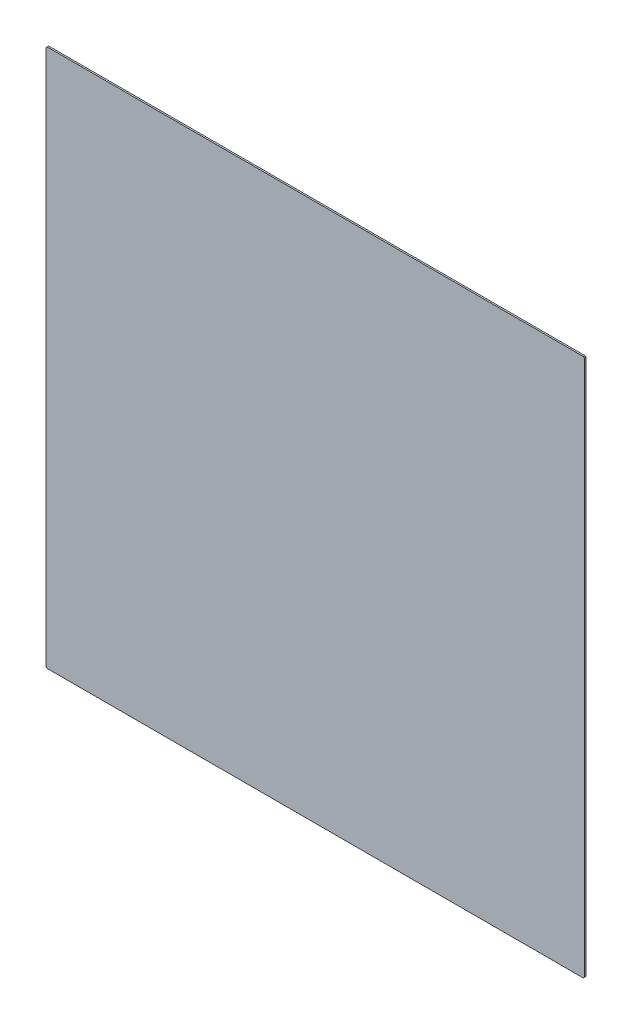
ISO-10303-21;
HEADER;
FILE_DESCRIPTION(('STEP AP214'),'2;1');
FILE_NAME('part.step','',(''),(''),'','','');
FILE_SCHEMA(('AUTOMOTIVE_DESIGN { 1 0 10303 214 1 1 1 1 }'));
ENDSEC;
DATA;
#1=APPLICATION_CONTEXT('core data for automotive mechanical design processes');
#2=APPLICATION_PROTOCOL_DEFINITION('international standard','automotive_design',2000,#1);
#3=PRODUCT_CONTEXT('',#1,'mechanical');
#4=PRODUCT('Part','Part','',(#3));
#5=PRODUCT_RELATED_PRODUCT_CATEGORY('part','',(#4));
#6=PRODUCT_DEFINITION_FORMATION('','',#4);
#7=PRODUCT_DEFINITION_CONTEXT('part definition',#1,'design');
#8=PRODUCT_DEFINITION('design','',#6,#7);
#9=PRODUCT_DEFINITION_SHAPE('','',#8);
#10=(LENGTH_UNIT() NAMED_UNIT(*) SI_UNIT(.MILLI.,.METRE.));
#11=(NAMED_UNIT(*) PLANE_ANGLE_UNIT() SI_UNIT($,.RADIAN.));
#12=(NAMED_UNIT(*) SI_UNIT($,.STERADIAN.) SOLID_ANGLE_UNIT());
#13=UNCERTAINTY_MEASURE_WITH_UNIT(LENGTH_MEASURE(1.E-05),#10,'distance_accuracy_value','');
#14=(GEOMETRIC_REPRESENTATION_CONTEXT(3) GLOBAL_UNCERTAINTY_ASSIGNED_CONTEXT((#13)) GLOBAL_UNIT_ASSIGNED_CONTEXT((#10,
#11,#12)) REPRESENTATION_CONTEXT('',''));
#15=CARTESIAN_POINT('',(0.,0.,0.));
#16=DIRECTION('',(0.,0.,1.));
#17=DIRECTION('',(1.,0.,0.));
#18=AXIS2_PLACEMENT_3D('',#15,#16,#17);
#19=CARTESIAN_POINT('',(520.,520.,-3.));
#20=DIRECTION('',(1.,0.,0.));
#21=DIRECTION('',(0.,1.,0.));
#22=AXIS2_PLACEMENT_3D('',#19,#20,#21);
#23=PLANE('',#22);
#24=DIRECTION('',(0.,1.,0.));
#25=VECTOR('',#24,1.);
#26=CARTESIAN_POINT('',(520.,520.,-3.));
#27=LINE('',#26,#25);
#28=CARTESIAN_POINT('',(520.,-518.,-3.));
#29=VERTEX_POINT('',#28);
#30=CARTESIAN_POINT('',(520.,518.,-3.));
#31=VERTEX_POINT('',#30);
#32=EDGE_CURVE('E194',#29,#31,#27,.T.);
#33=ORIENTED_EDGE('',*,*,#32,.T.);
#34=DIRECTION('',(0.,0.,1.));
#35=VECTOR('',#34,1.);
#36=CARTESIAN_POINT('',(520.,518.,-3.));
#37=LINE('',#36,#35);
#38=CARTESIAN_POINT('',(520.,518.,0.));
#39=VERTEX_POINT('',#38);
#40=EDGE_CURVE('E123',#31,#39,#37,.T.);
#41=ORIENTED_EDGE('',*,*,#40,.T.);
#42=DIRECTION('',(0.,1.,0.));
#43=VECTOR('',#42,1.);
#44=CARTESIAN_POINT('',(520.,520.,0.));
#45=LINE('',#44,#43);
#46=CARTESIAN_POINT('',(520.,-518.,0.));
#47=VERTEX_POINT('',#46);
#48=EDGE_CURVE('E114',#47,#39,#45,.T.);
#49=ORIENTED_EDGE('',*,*,#48,.F.);
#50=DIRECTION('',(0.,0.,-1.));
#51=VECTOR('',#50,1.);
#52=CARTESIAN_POINT('',(520.,-518.,-3.));
#53=LINE('',#52,#51);
#54=EDGE_CURVE('E128',#47,#29,#53,.T.);
#55=ORIENTED_EDGE('',*,*,#54,.T.);
#56=EDGE_LOOP('',(#33,#41,#49,#55));
#57=FACE_BOUND('',#56,.T.);
#58=ADVANCED_FACE('F43',(#57),#23,.T.);
#59=CARTESIAN_POINT('',(-520.,-520.,-3.));
#60=DIRECTION('',(0.,-1.,0.));
#61=DIRECTION('',(0.,0.,-1.));
#62=AXIS2_PLACEMENT_3D('',#59,#60,#61);
#63=PLANE('',#62);
#64=DIRECTION('',(1.,0.,0.));
#65=VECTOR('',#64,1.);
#66=CARTESIAN_POINT('',(-520.,-520.,0.));
#67=LINE('',#66,#65);
#68=CARTESIAN_POINT('',(-518.,-520.,0.));
#69=VERTEX_POINT('',#68);
#70=CARTESIAN_POINT('',(518.,-520.,0.));
#71=VERTEX_POINT('',#70);
#72=EDGE_CURVE('E116',#69,#71,#67,.T.);
#73=ORIENTED_EDGE('',*,*,#72,.F.);
#74=DIRECTION('',(0.,0.,-1.));
#75=VECTOR('',#74,1.);
#76=CARTESIAN_POINT('',(-518.,-520.,-3.));
#77=LINE('',#76,#75);
#78=CARTESIAN_POINT('',(-518.,-520.,-3.));
#79=VERTEX_POINT('',#78);
#80=EDGE_CURVE('E11',#69,#79,#77,.T.);
#81=ORIENTED_EDGE('',*,*,#80,.T.);
#82=DIRECTION('',(1.,0.,0.));
#83=VECTOR('',#82,1.);
#84=CARTESIAN_POINT('',(-520.,-520.,-3.));
#85=LINE('',#84,#83);
#86=CARTESIAN_POINT('',(518.,-520.,-3.));
#87=VERTEX_POINT('',#86);
#88=EDGE_CURVE('E137',#79,#87,#85,.T.);
#89=ORIENTED_EDGE('',*,*,#88,.T.);
#90=DIRECTION('',(0.,0.,1.));
#91=VECTOR('',#90,1.);
#92=CARTESIAN_POINT('',(518.,-520.,-3.));
#93=LINE('',#92,#91);
#94=EDGE_CURVE('E53',#87,#71,#93,.T.);
#95=ORIENTED_EDGE('',*,*,#94,.T.);
#96=EDGE_LOOP('',(#73,#81,#89,#95));
#97=FACE_BOUND('',#96,.T.);
#98=ADVANCED_FACE('F180',(#97),#63,.T.);
#99=CARTESIAN_POINT('',(-520.,520.,-3.));
#100=DIRECTION('',(-1.,0.,0.));
#101=DIRECTION('',(0.,0.,1.));
#102=AXIS2_PLACEMENT_3D('',#99,#100,#101);
#103=PLANE('',#102);
#104=DIRECTION('',(0.,-1.,0.));
#105=VECTOR('',#104,1.);
#106=CARTESIAN_POINT('',(-520.,520.,0.));
#107=LINE('',#106,#105);
#108=CARTESIAN_POINT('',(-520.,518.,0.));
#109=VERTEX_POINT('',#108);
#110=CARTESIAN_POINT('',(-520.,-518.,0.));
#111=VERTEX_POINT('',#110);
#112=EDGE_CURVE('E189',#109,#111,#107,.T.);
#113=ORIENTED_EDGE('',*,*,#112,.F.);
#114=DIRECTION('',(0.,0.,-1.));
#115=VECTOR('',#114,1.);
#116=CARTESIAN_POINT('',(-520.,518.,-3.));
#117=LINE('',#116,#115);
#118=CARTESIAN_POINT('',(-520.,518.,-3.));
#119=VERTEX_POINT('',#118);
#120=EDGE_CURVE('E67',#109,#119,#117,.T.);
#121=ORIENTED_EDGE('',*,*,#120,.T.);
#122=DIRECTION('',(0.,-1.,0.));
#123=VECTOR('',#122,1.);
#124=CARTESIAN_POINT('',(-520.,520.,-3.));
#125=LINE('',#124,#123);
#126=CARTESIAN_POINT('',(-520.,-518.,-3.));
#127=VERTEX_POINT('',#126);
#128=EDGE_CURVE('E143',#119,#127,#125,.T.);
#129=ORIENTED_EDGE('',*,*,#128,.T.);
#130=DIRECTION('',(0.,0.,1.));
#131=VECTOR('',#130,1.);
#132=CARTESIAN_POINT('',(-520.,-518.,-3.));
#133=LINE('',#132,#131);
#134=EDGE_CURVE('E173',#127,#111,#133,.T.);
#135=ORIENTED_EDGE('',*,*,#134,.T.);
#136=EDGE_LOOP('',(#113,#121,#129,#135));
#137=FACE_BOUND('',#136,.T.);
#138=ADVANCED_FACE('F188',(#137),#103,.T.);
#139=CARTESIAN_POINT('',(-520.,520.,-3.));
#140=DIRECTION('',(0.,1.,0.));
#141=DIRECTION('',(0.,0.,1.));
#142=AXIS2_PLACEMENT_3D('',#139,#140,#141);
#143=PLANE('',#142);
#144=DIRECTION('',(-1.,0.,0.));
#145=VECTOR('',#144,1.);
#146=CARTESIAN_POINT('',(-520.,520.,0.));
#147=LINE('',#146,#145);
#148=CARTESIAN_POINT('',(518.,520.,0.));
#149=VERTEX_POINT('',#148);
#150=CARTESIAN_POINT('',(-518.,520.,0.));
#151=VERTEX_POINT('',#150);
#152=EDGE_CURVE('E132',#149,#151,#147,.T.);
#153=ORIENTED_EDGE('',*,*,#152,.F.);
#154=DIRECTION('',(0.,0.,-1.));
#155=VECTOR('',#154,1.);
#156=CARTESIAN_POINT('',(518.,520.,-3.));
#157=LINE('',#156,#155);
#158=CARTESIAN_POINT('',(518.,520.,-3.));
#159=VERTEX_POINT('',#158);
#160=EDGE_CURVE('E160',#149,#159,#157,.T.);
#161=ORIENTED_EDGE('',*,*,#160,.T.);
#162=DIRECTION('',(-1.,0.,0.));
#163=VECTOR('',#162,1.);
#164=CARTESIAN_POINT('',(-520.,520.,-3.));
#165=LINE('',#164,#163);
#166=CARTESIAN_POINT('',(-518.,520.,-3.));
#167=VERTEX_POINT('',#166);
#168=EDGE_CURVE('E199',#159,#167,#165,.T.);
#169=ORIENTED_EDGE('',*,*,#168,.T.);
#170=DIRECTION('',(0.,0.,1.));
#171=VECTOR('',#170,1.);
#172=CARTESIAN_POINT('',(-518.,520.,-3.));
#173=LINE('',#172,#171);
#174=EDGE_CURVE('E156',#167,#151,#173,.T.);
#175=ORIENTED_EDGE('',*,*,#174,.T.);
#176=EDGE_LOOP('',(#153,#161,#169,#175));
#177=FACE_BOUND('',#176,.T.);
#178=ADVANCED_FACE('F210',(#177),#143,.T.);
#179=CARTESIAN_POINT('',(0.,0.,-3.));
#180=DIRECTION('',(0.,0.,1.));
#181=DIRECTION('',(1.,0.,0.));
#182=AXIS2_PLACEMENT_3D('',#179,#180,#181);
#183=PLANE('',#182);
#184=ORIENTED_EDGE('',*,*,#168,.F.);
#185=DIRECTION('',(-0.707106781186548,0.707106781186548,0.));
#186=VECTOR('',#185,1.);
#187=CARTESIAN_POINT('',(520.,518.,-3.));
#188=LINE('',#187,#186);
#189=EDGE_CURVE('E170',#159,#31,#188,.F.);
#190=ORIENTED_EDGE('',*,*,#189,.T.);
#191=ORIENTED_EDGE('',*,*,#32,.F.);
#192=DIRECTION('',(0.707106781186489,0.707106781186606,0.));
#193=VECTOR('',#192,1.);
#194=CARTESIAN_POINT('',(518.,-520.,-3.));
#195=LINE('',#194,#193);
#196=EDGE_CURVE('E135',#29,#87,#195,.F.);
#197=ORIENTED_EDGE('',*,*,#196,.T.);
#198=ORIENTED_EDGE('',*,*,#88,.F.);
#199=DIRECTION('',(0.707106781186528,-0.707106781186567,0.));
#200=VECTOR('',#199,1.);
#201=CARTESIAN_POINT('',(-520.,-518.,-3.));
#202=LINE('',#201,#200);
#203=EDGE_CURVE('E60',#79,#127,#202,.F.);
#204=ORIENTED_EDGE('',*,*,#203,.T.);
#205=ORIENTED_EDGE('',*,*,#128,.F.);
#206=DIRECTION('',(-0.707106781186548,-0.707106781186548,0.));
#207=VECTOR('',#206,1.);
#208=CARTESIAN_POINT('',(-518.,520.,-3.));
#209=LINE('',#208,#207);
#210=EDGE_CURVE('E167',#119,#167,#209,.F.);
#211=ORIENTED_EDGE('',*,*,#210,.T.);
#212=EDGE_LOOP('',(#184,#190,#191,#197,#198,#204,#205,#211));
#213=FACE_BOUND('',#212,.T.);
#214=ADVANCED_FACE('F183',(#213),#183,.F.);
#215=CARTESIAN_POINT('',(0.,0.,0.));
#216=DIRECTION('',(0.,0.,1.));
#217=DIRECTION('',(1.,0.,0.));
#218=AXIS2_PLACEMENT_3D('',#215,#216,#217);
#219=PLANE('',#218);
#220=ORIENTED_EDGE('',*,*,#48,.T.);
#221=DIRECTION('',(0.707106781186548,-0.707106781186548,0.));
#222=VECTOR('',#221,1.);
#223=CARTESIAN_POINT('',(519.,519.,0.));
#224=LINE('',#223,#222);
#225=EDGE_CURVE('E153',#39,#149,#224,.F.);
#226=ORIENTED_EDGE('',*,*,#225,.T.);
#227=ORIENTED_EDGE('',*,*,#152,.T.);
#228=DIRECTION('',(0.707106781186548,0.707106781186548,0.));
#229=VECTOR('',#228,1.);
#230=CARTESIAN_POINT('',(-519.,519.,0.));
#231=LINE('',#230,#229);
#232=EDGE_CURVE('E150',#151,#109,#231,.F.);
#233=ORIENTED_EDGE('',*,*,#232,.T.);
#234=ORIENTED_EDGE('',*,*,#112,.T.);
#235=DIRECTION('',(-0.707106781186528,0.707106781186567,0.));
#236=VECTOR('',#235,1.);
#237=CARTESIAN_POINT('',(-519.000000000014,-518.999999999986,0.));
#238=LINE('',#237,#236);
#239=EDGE_CURVE('E122',#111,#69,#238,.F.);
#240=ORIENTED_EDGE('',*,*,#239,.T.);
#241=ORIENTED_EDGE('',*,*,#72,.T.);
#242=DIRECTION('',(-0.707106781186489,-0.707106781186606,0.));
#243=VECTOR('',#242,1.);
#244=CARTESIAN_POINT('',(519.000000000043,-518.999999999957,0.));
#245=LINE('',#244,#243);
#246=EDGE_CURVE('E111',#71,#47,#245,.F.);
#247=ORIENTED_EDGE('',*,*,#246,.T.);
#248=EDGE_LOOP('',(#220,#226,#227,#233,#234,#240,#241,#247));
#249=FACE_BOUND('',#248,.T.);
#250=ADVANCED_FACE('F113',(#249),#219,.T.);
#251=CARTESIAN_POINT('',(520.,518.,-3.));
#252=DIRECTION('',(-0.707106781186548,-0.707106781186548,0.));
#253=DIRECTION('',(0.,0.,1.));
#254=AXIS2_PLACEMENT_3D('',#251,#252,#253);
#255=PLANE('',#254);
#256=ORIENTED_EDGE('',*,*,#189,.F.);
#257=ORIENTED_EDGE('',*,*,#160,.F.);
#258=ORIENTED_EDGE('',*,*,#225,.F.);
#259=ORIENTED_EDGE('',*,*,#40,.F.);
#260=EDGE_LOOP('',(#256,#257,#258,#259));
#261=FACE_BOUND('',#260,.T.);
#262=ADVANCED_FACE('F206',(#261),#255,.F.);
#263=CARTESIAN_POINT('',(-518.,520.,-3.));
#264=DIRECTION('',(0.707106781186547,-0.707106781186547,0.));
#265=DIRECTION('',(0.,0.,1.));
#266=AXIS2_PLACEMENT_3D('',#263,#264,#265);
#267=PLANE('',#266);
#268=ORIENTED_EDGE('',*,*,#210,.F.);
#269=ORIENTED_EDGE('',*,*,#120,.F.);
#270=ORIENTED_EDGE('',*,*,#232,.F.);
#271=ORIENTED_EDGE('',*,*,#174,.F.);
#272=EDGE_LOOP('',(#268,#269,#270,#271));
#273=FACE_BOUND('',#272,.T.);
#274=ADVANCED_FACE('F214',(#273),#267,.F.);
#275=CARTESIAN_POINT('',(-520.,-518.,-3.));
#276=DIRECTION('',(0.707106781186567,0.707106781186528,0.));
#277=DIRECTION('',(0.,0.,1.));
#278=AXIS2_PLACEMENT_3D('',#275,#276,#277);
#279=PLANE('',#278);
#280=ORIENTED_EDGE('',*,*,#203,.F.);
#281=ORIENTED_EDGE('',*,*,#80,.F.);
#282=ORIENTED_EDGE('',*,*,#239,.F.);
#283=ORIENTED_EDGE('',*,*,#134,.F.);
#284=EDGE_LOOP('',(#280,#281,#282,#283));
#285=FACE_BOUND('',#284,.T.);
#286=ADVANCED_FACE('F186',(#285),#279,.F.);
#287=CARTESIAN_POINT('',(518.,-520.,-3.));
#288=DIRECTION('',(-0.707106781186606,0.707106781186489,0.));
#289=DIRECTION('',(0.,0.,1.));
#290=AXIS2_PLACEMENT_3D('',#287,#288,#289);
#291=PLANE('',#290);
#292=ORIENTED_EDGE('',*,*,#196,.F.);
#293=ORIENTED_EDGE('',*,*,#54,.F.);
#294=ORIENTED_EDGE('',*,*,#246,.F.);
#295=ORIENTED_EDGE('',*,*,#94,.F.);
#296=EDGE_LOOP('',(#292,#293,#294,#295));
#297=FACE_BOUND('',#296,.T.);
#298=ADVANCED_FACE('F46',(#297),#291,.F.);
#299=CLOSED_SHELL('',(#58,#98,#138,#178,#214,#250,#262,#274,#286,#298));
#300=MANIFOLD_SOLID_BREP('B2',#299);
#301=ADVANCED_BREP_SHAPE_REPRESENTATION('',(#18,#300),#14);
#302=SHAPE_DEFINITION_REPRESENTATION(#9,#301);
ENDSEC;
END-ISO-10303-21;
